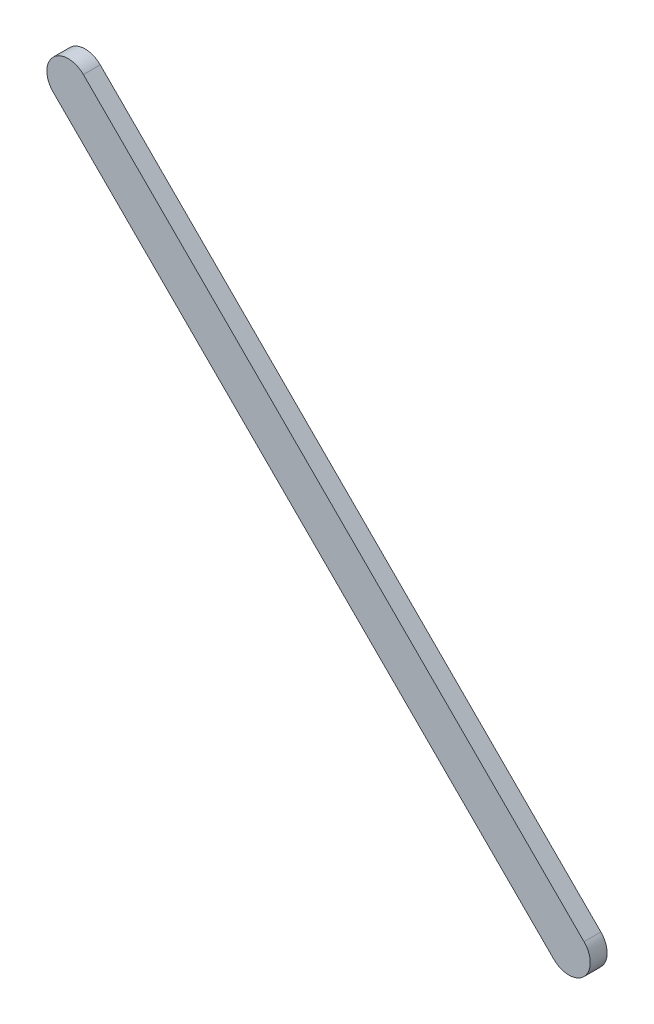
ISO-10303-21;
HEADER;
FILE_DESCRIPTION(('STEP AP214'),'2;1');
FILE_NAME('part.step','',(''),(''),'','','');
FILE_SCHEMA(('AUTOMOTIVE_DESIGN { 1 0 10303 214 1 1 1 1 }'));
ENDSEC;
DATA;
#1=APPLICATION_CONTEXT('core data for automotive mechanical design processes');
#2=APPLICATION_PROTOCOL_DEFINITION('international standard','automotive_design',2000,#1);
#3=PRODUCT_CONTEXT('',#1,'mechanical');
#4=PRODUCT('Part','Part','',(#3));
#5=PRODUCT_RELATED_PRODUCT_CATEGORY('part','',(#4));
#6=PRODUCT_DEFINITION_FORMATION('','',#4);
#7=PRODUCT_DEFINITION_CONTEXT('part definition',#1,'design');
#8=PRODUCT_DEFINITION('design','',#6,#7);
#9=PRODUCT_DEFINITION_SHAPE('','',#8);
#10=(LENGTH_UNIT() NAMED_UNIT(*) SI_UNIT(.MILLI.,.METRE.));
#11=(NAMED_UNIT(*) PLANE_ANGLE_UNIT() SI_UNIT($,.RADIAN.));
#12=(NAMED_UNIT(*) SI_UNIT($,.STERADIAN.) SOLID_ANGLE_UNIT());
#13=UNCERTAINTY_MEASURE_WITH_UNIT(LENGTH_MEASURE(1.E-05),#10,'distance_accuracy_value','');
#14=(GEOMETRIC_REPRESENTATION_CONTEXT(3) GLOBAL_UNCERTAINTY_ASSIGNED_CONTEXT((#13)) GLOBAL_UNIT_ASSIGNED_CONTEXT((#10,
#11,#12)) REPRESENTATION_CONTEXT('',''));
#15=CARTESIAN_POINT('',(0.,0.,0.));
#16=DIRECTION('',(0.,0.,1.));
#17=DIRECTION('',(1.,0.,0.));
#18=AXIS2_PLACEMENT_3D('',#15,#16,#17);
#19=CARTESIAN_POINT('',(116.15239406,120.08939406,0.));
#20=DIRECTION('',(0.707106781186548,0.707106781186547,0.));
#21=DIRECTION('',(0.707106781186547,-0.707106781186548,0.));
#22=AXIS2_PLACEMENT_3D('',#19,#20,#21);
#23=PLANE('',#22);
#24=DIRECTION('',(0.707106781186547,-0.707106781186548,0.));
#25=VECTOR('',#24,1.);
#26=CARTESIAN_POINT('',(116.15239406,120.08939406,0.1999996));
#27=LINE('',#26,#25);
#28=CARTESIAN_POINT('',(116.15239406,120.08939406,0.1999996));
#29=VERTEX_POINT('',#28);
#30=CARTESIAN_POINT('',(122.09599406,114.14579406,0.1999996));
#31=VERTEX_POINT('',#30);
#32=EDGE_CURVE('E11',#29,#31,#27,.T.);
#33=ORIENTED_EDGE('',*,*,#32,.F.);
#34=DIRECTION('',(0.,0.,1.));
#35=VECTOR('',#34,1.);
#36=CARTESIAN_POINT('',(116.15239406,120.08939406,0.));
#37=LINE('',#36,#35);
#38=CARTESIAN_POINT('',(116.15239406,120.08939406,0.));
#39=VERTEX_POINT('',#38);
#40=EDGE_CURVE('E24',#39,#29,#37,.T.);
#41=ORIENTED_EDGE('',*,*,#40,.F.);
#42=DIRECTION('',(0.707106781186547,-0.707106781186548,0.));
#43=VECTOR('',#42,1.);
#44=CARTESIAN_POINT('',(116.15239406,120.08939406,0.));
#45=LINE('',#44,#43);
#46=CARTESIAN_POINT('',(122.09599406,114.14579406,0.));
#47=VERTEX_POINT('',#46);
#48=EDGE_CURVE('E75',#39,#47,#45,.T.);
#49=ORIENTED_EDGE('',*,*,#48,.T.);
#50=DIRECTION('',(0.,0.,1.));
#51=VECTOR('',#50,1.);
#52=CARTESIAN_POINT('',(122.09599406,114.14579406,0.));
#53=LINE('',#52,#51);
#54=EDGE_CURVE('E37',#47,#31,#53,.T.);
#55=ORIENTED_EDGE('',*,*,#54,.T.);
#56=EDGE_LOOP('',(#33,#41,#49,#55));
#57=FACE_BOUND('',#56,.T.);
#58=ADVANCED_FACE('F17',(#57),#23,.F.);
#59=CARTESIAN_POINT('',(122.2756,114.3254,0.));
#60=DIRECTION('',(0.,0.,-1.));
#61=DIRECTION('',(-0.707106781186548,-0.707106781186548,0.));
#62=AXIS2_PLACEMENT_3D('',#59,#60,#61);
#63=CYLINDRICAL_SURFACE('',#62,0.254001156230771);
#64=CARTESIAN_POINT('',(122.2756,114.3254,0.1999996));
#65=DIRECTION('',(0.,0.,1.));
#66=DIRECTION('',(-0.707106781186548,-0.707106781186548,0.));
#67=AXIS2_PLACEMENT_3D('',#64,#65,#66);
#68=CIRCLE('',#67,0.254001156230771);
#69=CARTESIAN_POINT('',(122.45520594,114.50500594,0.1999996));
#70=VERTEX_POINT('',#69);
#71=EDGE_CURVE('E83',#31,#70,#68,.T.);
#72=ORIENTED_EDGE('',*,*,#71,.F.);
#73=ORIENTED_EDGE('',*,*,#54,.F.);
#74=CARTESIAN_POINT('',(122.2756,114.3254,0.));
#75=DIRECTION('',(0.,0.,1.));
#76=DIRECTION('',(-0.707106781186548,-0.707106781186548,0.));
#77=AXIS2_PLACEMENT_3D('',#74,#75,#76);
#78=CIRCLE('',#77,0.254001156230771);
#79=CARTESIAN_POINT('',(122.45520594,114.50500594,0.));
#80=VERTEX_POINT('',#79);
#81=EDGE_CURVE('E81',#47,#80,#78,.T.);
#82=ORIENTED_EDGE('',*,*,#81,.T.);
#83=DIRECTION('',(0.,0.,1.));
#84=VECTOR('',#83,1.);
#85=CARTESIAN_POINT('',(122.45520594,114.50500594,0.));
#86=LINE('',#85,#84);
#87=EDGE_CURVE('E67',#80,#70,#86,.T.);
#88=ORIENTED_EDGE('',*,*,#87,.T.);
#89=EDGE_LOOP('',(#72,#73,#82,#88));
#90=FACE_BOUND('',#89,.T.);
#91=ADVANCED_FACE('F89',(#90),#63,.T.);
#92=CARTESIAN_POINT('',(122.45520594,114.50500594,0.));
#93=DIRECTION('',(-0.707106781186548,-0.707106781186547,0.));
#94=DIRECTION('',(-0.707106781186547,0.707106781186548,0.));
#95=AXIS2_PLACEMENT_3D('',#92,#93,#94);
#96=PLANE('',#95);
#97=DIRECTION('',(-0.707106781186547,0.707106781186548,0.));
#98=VECTOR('',#97,1.);
#99=CARTESIAN_POINT('',(122.45520594,114.50500594,0.1999996));
#100=LINE('',#99,#98);
#101=CARTESIAN_POINT('',(116.51160594,120.44860594,0.1999996));
#102=VERTEX_POINT('',#101);
#103=EDGE_CURVE('E71',#70,#102,#100,.T.);
#104=ORIENTED_EDGE('',*,*,#103,.F.);
#105=ORIENTED_EDGE('',*,*,#87,.F.);
#106=DIRECTION('',(-0.707106781186547,0.707106781186548,0.));
#107=VECTOR('',#106,1.);
#108=CARTESIAN_POINT('',(122.45520594,114.50500594,0.));
#109=LINE('',#108,#107);
#110=CARTESIAN_POINT('',(116.51160594,120.44860594,0.));
#111=VERTEX_POINT('',#110);
#112=EDGE_CURVE('E63',#80,#111,#109,.T.);
#113=ORIENTED_EDGE('',*,*,#112,.T.);
#114=DIRECTION('',(0.,0.,1.));
#115=VECTOR('',#114,1.);
#116=CARTESIAN_POINT('',(116.51160594,120.44860594,0.));
#117=LINE('',#116,#115);
#118=EDGE_CURVE('E53',#111,#102,#117,.T.);
#119=ORIENTED_EDGE('',*,*,#118,.T.);
#120=EDGE_LOOP('',(#104,#105,#113,#119));
#121=FACE_BOUND('',#120,.T.);
#122=ADVANCED_FACE('F66',(#121),#96,.F.);
#123=CARTESIAN_POINT('',(116.332,120.269,0.));
#124=DIRECTION('',(0.,0.,-1.));
#125=DIRECTION('',(0.707106781186548,0.707106781186548,0.));
#126=AXIS2_PLACEMENT_3D('',#123,#124,#125);
#127=CYLINDRICAL_SURFACE('',#126,0.254001156230771);
#128=CARTESIAN_POINT('',(116.332,120.269,0.1999996));
#129=DIRECTION('',(0.,0.,1.));
#130=DIRECTION('',(0.707106781186548,0.707106781186548,0.));
#131=AXIS2_PLACEMENT_3D('',#128,#129,#130);
#132=CIRCLE('',#131,0.254001156230771);
#133=EDGE_CURVE('E59',#102,#29,#132,.T.);
#134=ORIENTED_EDGE('',*,*,#133,.F.);
#135=ORIENTED_EDGE('',*,*,#118,.F.);
#136=CARTESIAN_POINT('',(116.332,120.269,0.));
#137=DIRECTION('',(0.,0.,1.));
#138=DIRECTION('',(0.707106781186548,0.707106781186548,0.));
#139=AXIS2_PLACEMENT_3D('',#136,#137,#138);
#140=CIRCLE('',#139,0.254001156230771);
#141=EDGE_CURVE('E57',#111,#39,#140,.T.);
#142=ORIENTED_EDGE('',*,*,#141,.T.);
#143=ORIENTED_EDGE('',*,*,#40,.T.);
#144=EDGE_LOOP('',(#134,#135,#142,#143));
#145=FACE_BOUND('',#144,.T.);
#146=ADVANCED_FACE('F55',(#145),#127,.T.);
#147=CARTESIAN_POINT('',(116.15239406,120.08939406,0.));
#148=DIRECTION('',(0.,0.,-1.));
#149=DIRECTION('',(-1.,0.,0.));
#150=AXIS2_PLACEMENT_3D('',#147,#148,#149);
#151=PLANE('',#150);
#152=ORIENTED_EDGE('',*,*,#141,.F.);
#153=ORIENTED_EDGE('',*,*,#112,.F.);
#154=ORIENTED_EDGE('',*,*,#81,.F.);
#155=ORIENTED_EDGE('',*,*,#48,.F.);
#156=EDGE_LOOP('',(#152,#153,#154,#155));
#157=FACE_BOUND('',#156,.T.);
#158=ADVANCED_FACE('F74',(#157),#151,.T.);
#159=CARTESIAN_POINT('',(116.15239406,120.08939406,0.1999996));
#160=DIRECTION('',(0.,0.,-1.));
#161=DIRECTION('',(-1.,0.,0.));
#162=AXIS2_PLACEMENT_3D('',#159,#160,#161);
#163=PLANE('',#162);
#164=ORIENTED_EDGE('',*,*,#32,.T.);
#165=ORIENTED_EDGE('',*,*,#71,.T.);
#166=ORIENTED_EDGE('',*,*,#103,.T.);
#167=ORIENTED_EDGE('',*,*,#133,.T.);
#168=EDGE_LOOP('',(#164,#165,#166,#167));
#169=FACE_BOUND('',#168,.T.);
#170=ADVANCED_FACE('F91',(#169),#163,.F.);
#171=CLOSED_SHELL('',(#58,#91,#122,#146,#158,#170));
#172=MANIFOLD_SOLID_BREP('B1',#171);
#173=ADVANCED_BREP_SHAPE_REPRESENTATION('',(#18,#172),#14);
#174=SHAPE_DEFINITION_REPRESENTATION(#9,#173);
ENDSEC;
END-ISO-10303-21;
